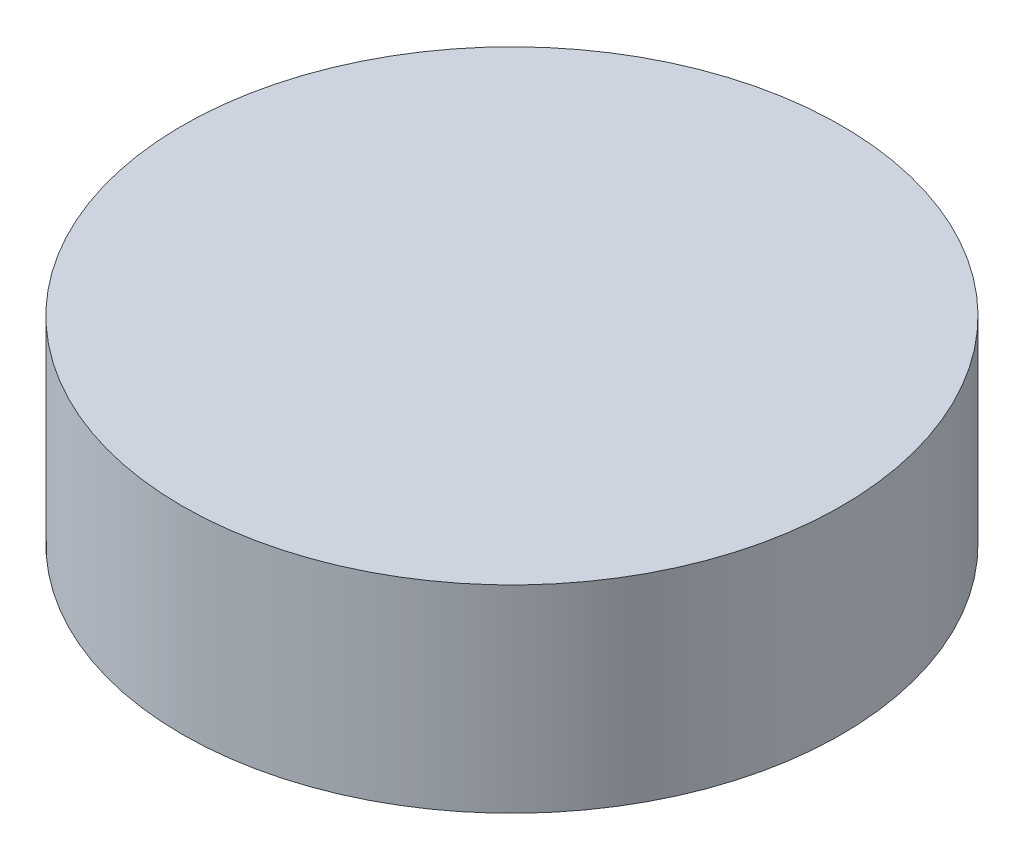
ISO-10303-21;
HEADER;
FILE_DESCRIPTION(('STEP AP214'),'2;1');
FILE_NAME('part.step','',(''),(''),'','','');
FILE_SCHEMA(('AUTOMOTIVE_DESIGN { 1 0 10303 214 1 1 1 1 }'));
ENDSEC;
DATA;
#1=APPLICATION_CONTEXT('core data for automotive mechanical design processes');
#2=APPLICATION_PROTOCOL_DEFINITION('international standard','automotive_design',2000,#1);
#3=PRODUCT_CONTEXT('',#1,'mechanical');
#4=PRODUCT('Part','Part','',(#3));
#5=PRODUCT_RELATED_PRODUCT_CATEGORY('part','',(#4));
#6=PRODUCT_DEFINITION_FORMATION('','',#4);
#7=PRODUCT_DEFINITION_CONTEXT('part definition',#1,'design');
#8=PRODUCT_DEFINITION('design','',#6,#7);
#9=PRODUCT_DEFINITION_SHAPE('','',#8);
#10=(LENGTH_UNIT() NAMED_UNIT(*) SI_UNIT(.MILLI.,.METRE.));
#11=(NAMED_UNIT(*) PLANE_ANGLE_UNIT() SI_UNIT($,.RADIAN.));
#12=(NAMED_UNIT(*) SI_UNIT($,.STERADIAN.) SOLID_ANGLE_UNIT());
#13=UNCERTAINTY_MEASURE_WITH_UNIT(LENGTH_MEASURE(1.E-05),#10,'distance_accuracy_value','');
#14=(GEOMETRIC_REPRESENTATION_CONTEXT(3) GLOBAL_UNCERTAINTY_ASSIGNED_CONTEXT((#13)) GLOBAL_UNIT_ASSIGNED_CONTEXT((#10,
#11,#12)) REPRESENTATION_CONTEXT('',''));
#15=CARTESIAN_POINT('',(0.,0.,0.));
#16=DIRECTION('',(0.,0.,1.));
#17=DIRECTION('',(1.,0.,0.));
#18=AXIS2_PLACEMENT_3D('',#15,#16,#17);
#19=CARTESIAN_POINT('',(0.,3.,0.));
#20=DIRECTION('',(0.,-1.,0.));
#21=DIRECTION('',(0.,0.,-1.));
#22=AXIS2_PLACEMENT_3D('',#19,#20,#21);
#23=CYLINDRICAL_SURFACE('',#22,5.);
#24=CARTESIAN_POINT('',(0.,3.,0.));
#25=DIRECTION('',(0.,1.,0.));
#26=DIRECTION('',(0.,0.,1.));
#27=AXIS2_PLACEMENT_3D('',#24,#25,#26);
#28=CIRCLE('',#27,5.);
#29=CARTESIAN_POINT('',(0.,3.,5.));
#30=VERTEX_POINT('',#29);
#31=EDGE_CURVE('E10',#30,#30,#28,.T.);
#32=ORIENTED_EDGE('',*,*,#31,.F.);
#33=EDGE_LOOP('',(#32));
#34=FACE_BOUND('',#33,.T.);
#35=CARTESIAN_POINT('',(0.,0.,0.));
#36=DIRECTION('',(0.,1.,0.));
#37=DIRECTION('',(0.,0.,1.));
#38=AXIS2_PLACEMENT_3D('',#35,#36,#37);
#39=CIRCLE('',#38,5.);
#40=CARTESIAN_POINT('',(0.,0.,5.));
#41=VERTEX_POINT('',#40);
#42=EDGE_CURVE('E40',#41,#41,#39,.T.);
#43=ORIENTED_EDGE('',*,*,#42,.T.);
#44=EDGE_LOOP('',(#43));
#45=FACE_BOUND('',#44,.T.);
#46=ADVANCED_FACE('F37',(#34,#45),#23,.T.);
#47=CARTESIAN_POINT('',(0.,3.,0.));
#48=DIRECTION('',(0.,1.,0.));
#49=DIRECTION('',(0.,0.,1.));
#50=AXIS2_PLACEMENT_3D('',#47,#48,#49);
#51=PLANE('',#50);
#52=ORIENTED_EDGE('',*,*,#31,.T.);
#53=EDGE_LOOP('',(#52));
#54=FACE_BOUND('',#53,.T.);
#55=ADVANCED_FACE('F54',(#54),#51,.T.);
#56=CARTESIAN_POINT('',(0.,0.,0.));
#57=DIRECTION('',(0.,1.,0.));
#58=DIRECTION('',(0.,0.,1.));
#59=AXIS2_PLACEMENT_3D('',#56,#57,#58);
#60=PLANE('',#59);
#61=ORIENTED_EDGE('',*,*,#42,.F.);
#62=EDGE_LOOP('',(#61));
#63=FACE_BOUND('',#62,.T.);
#64=ADVANCED_FACE('F52',(#63),#60,.F.);
#65=CLOSED_SHELL('',(#46,#55,#64));
#66=MANIFOLD_SOLID_BREP('B2',#65);
#67=ADVANCED_BREP_SHAPE_REPRESENTATION('',(#18,#66),#14);
#68=SHAPE_DEFINITION_REPRESENTATION(#9,#67);
ENDSEC;
END-ISO-10303-21;
